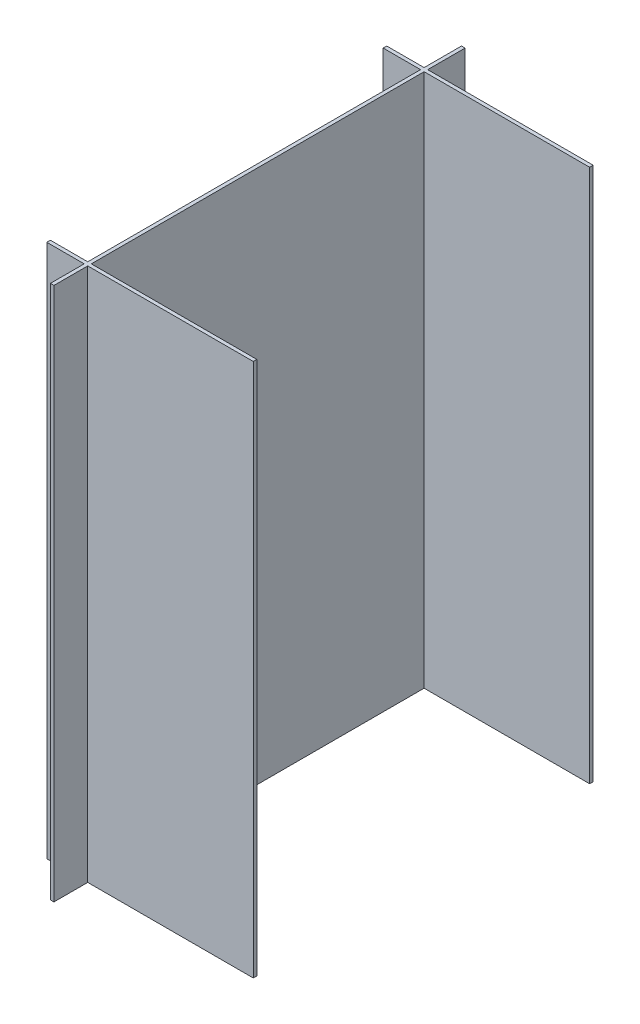
ISO-10303-21;
HEADER;
FILE_DESCRIPTION(('STEP AP214'),'2;1');
FILE_NAME('part.step','',(''),(''),'','','');
FILE_SCHEMA(('AUTOMOTIVE_DESIGN { 1 0 10303 214 1 1 1 1 }'));
ENDSEC;
DATA;
#1=APPLICATION_CONTEXT('core data for automotive mechanical design processes');
#2=APPLICATION_PROTOCOL_DEFINITION('international standard','automotive_design',2000,#1);
#3=PRODUCT_CONTEXT('',#1,'mechanical');
#4=PRODUCT('Part','Part','',(#3));
#5=PRODUCT_RELATED_PRODUCT_CATEGORY('part','',(#4));
#6=PRODUCT_DEFINITION_FORMATION('','',#4);
#7=PRODUCT_DEFINITION_CONTEXT('part definition',#1,'design');
#8=PRODUCT_DEFINITION('design','',#6,#7);
#9=PRODUCT_DEFINITION_SHAPE('','',#8);
#10=(LENGTH_UNIT() NAMED_UNIT(*) SI_UNIT(.MILLI.,.METRE.));
#11=(NAMED_UNIT(*) PLANE_ANGLE_UNIT() SI_UNIT($,.RADIAN.));
#12=(NAMED_UNIT(*) SI_UNIT($,.STERADIAN.) SOLID_ANGLE_UNIT());
#13=UNCERTAINTY_MEASURE_WITH_UNIT(LENGTH_MEASURE(1.E-05),#10,'distance_accuracy_value','');
#14=(GEOMETRIC_REPRESENTATION_CONTEXT(3) GLOBAL_UNCERTAINTY_ASSIGNED_CONTEXT((#13)) GLOBAL_UNIT_ASSIGNED_CONTEXT((#10,
#11,#12)) REPRESENTATION_CONTEXT('',''));
#15=CARTESIAN_POINT('',(0.,0.,0.));
#16=DIRECTION('',(0.,0.,1.));
#17=DIRECTION('',(1.,0.,0.));
#18=AXIS2_PLACEMENT_3D('',#15,#16,#17);
#19=CARTESIAN_POINT('',(-56.1616111521953,300.,42.3022668872637));
#20=DIRECTION('',(1.,0.,0.));
#21=DIRECTION('',(0.,0.,-1.));
#22=AXIS2_PLACEMENT_3D('',#19,#20,#21);
#23=PLANE('',#22);
#24=DIRECTION('',(0.,0.,1.));
#25=VECTOR('',#24,1.);
#26=CARTESIAN_POINT('',(-56.1616111521953,0.,42.3022668872637));
#27=LINE('',#26,#25);
#28=CARTESIAN_POINT('',(-56.1616111521953,0.,42.3022668872637));
#29=VERTEX_POINT('',#28);
#30=CARTESIAN_POINT('',(-56.1616111521953,0.,44.3022668872637));
#31=VERTEX_POINT('',#30);
#32=EDGE_CURVE('E214',#29,#31,#27,.T.);
#33=ORIENTED_EDGE('',*,*,#32,.T.);
#34=DIRECTION('',(0.,-1.,0.));
#35=VECTOR('',#34,1.);
#36=CARTESIAN_POINT('',(-56.1616111521953,300.,44.3022668872637));
#37=LINE('',#36,#35);
#38=CARTESIAN_POINT('',(-56.1616111521953,300.,44.3022668872637));
#39=VERTEX_POINT('',#38);
#40=EDGE_CURVE('E11',#39,#31,#37,.T.);
#41=ORIENTED_EDGE('',*,*,#40,.F.);
#42=DIRECTION('',(0.,0.,1.));
#43=VECTOR('',#42,1.);
#44=CARTESIAN_POINT('',(-56.1616111521953,300.,42.3022668872637));
#45=LINE('',#44,#43);
#46=CARTESIAN_POINT('',(-56.1616111521953,300.,42.3022668872637));
#47=VERTEX_POINT('',#46);
#48=EDGE_CURVE('E272',#47,#39,#45,.T.);
#49=ORIENTED_EDGE('',*,*,#48,.F.);
#50=DIRECTION('',(0.,-1.,0.));
#51=VECTOR('',#50,1.);
#52=CARTESIAN_POINT('',(-56.1616111521953,300.,42.3022668872637));
#53=LINE('',#52,#51);
#54=EDGE_CURVE('E210',#47,#29,#53,.T.);
#55=ORIENTED_EDGE('',*,*,#54,.T.);
#56=EDGE_LOOP('',(#33,#41,#49,#55));
#57=FACE_BOUND('',#56,.T.);
#58=ADVANCED_FACE('F41',(#57),#23,.F.);
#59=CARTESIAN_POINT('',(-56.1616111521953,300.,44.3022668872637));
#60=DIRECTION('',(0.,0.,-1.));
#61=DIRECTION('',(-1.,0.,0.));
#62=AXIS2_PLACEMENT_3D('',#59,#60,#61);
#63=PLANE('',#62);
#64=DIRECTION('',(1.,0.,0.));
#65=VECTOR('',#64,1.);
#66=CARTESIAN_POINT('',(-56.1616111521953,0.,44.3022668872637));
#67=LINE('',#66,#65);
#68=CARTESIAN_POINT('',(-35.1616111521953,0.,44.3022668872637));
#69=VERTEX_POINT('',#68);
#70=EDGE_CURVE('E218',#31,#69,#67,.T.);
#71=ORIENTED_EDGE('',*,*,#70,.T.);
#72=DIRECTION('',(0.,-1.,0.));
#73=VECTOR('',#72,1.);
#74=CARTESIAN_POINT('',(-35.1616111521953,300.,44.3022668872637));
#75=LINE('',#74,#73);
#76=CARTESIAN_POINT('',(-35.1616111521953,300.,44.3022668872637));
#77=VERTEX_POINT('',#76);
#78=EDGE_CURVE('E50',#77,#69,#75,.T.);
#79=ORIENTED_EDGE('',*,*,#78,.F.);
#80=DIRECTION('',(1.,0.,0.));
#81=VECTOR('',#80,1.);
#82=CARTESIAN_POINT('',(-56.1616111521953,300.,44.3022668872637));
#83=LINE('',#82,#81);
#84=EDGE_CURVE('E137',#39,#77,#83,.T.);
#85=ORIENTED_EDGE('',*,*,#84,.F.);
#86=ORIENTED_EDGE('',*,*,#40,.T.);
#87=EDGE_LOOP('',(#71,#79,#85,#86));
#88=FACE_BOUND('',#87,.T.);
#89=ADVANCED_FACE('F422',(#88),#63,.F.);
#90=CARTESIAN_POINT('',(-35.1616111521953,300.,44.3022668872637));
#91=DIRECTION('',(1.,0.,0.));
#92=DIRECTION('',(0.,0.,-1.));
#93=AXIS2_PLACEMENT_3D('',#90,#91,#92);
#94=PLANE('',#93);
#95=DIRECTION('',(0.,0.,1.));
#96=VECTOR('',#95,1.);
#97=CARTESIAN_POINT('',(-35.1616111521953,0.,44.3022668872637));
#98=LINE('',#97,#96);
#99=CARTESIAN_POINT('',(-35.1616111521953,0.,231.302266887264));
#100=VERTEX_POINT('',#99);
#101=EDGE_CURVE('E221',#69,#100,#98,.T.);
#102=ORIENTED_EDGE('',*,*,#101,.T.);
#103=DIRECTION('',(0.,-1.,0.));
#104=VECTOR('',#103,1.);
#105=CARTESIAN_POINT('',(-35.1616111521953,300.,231.302266887264));
#106=LINE('',#105,#104);
#107=CARTESIAN_POINT('',(-35.1616111521953,300.,231.302266887264));
#108=VERTEX_POINT('',#107);
#109=EDGE_CURVE('E331',#108,#100,#106,.T.);
#110=ORIENTED_EDGE('',*,*,#109,.F.);
#111=DIRECTION('',(0.,0.,1.));
#112=VECTOR('',#111,1.);
#113=CARTESIAN_POINT('',(-35.1616111521953,300.,44.3022668872637));
#114=LINE('',#113,#112);
#115=EDGE_CURVE('E341',#77,#108,#114,.T.);
#116=ORIENTED_EDGE('',*,*,#115,.F.);
#117=ORIENTED_EDGE('',*,*,#78,.T.);
#118=EDGE_LOOP('',(#102,#110,#116,#117));
#119=FACE_BOUND('',#118,.T.);
#120=ADVANCED_FACE('F339',(#119),#94,.F.);
#121=CARTESIAN_POINT('',(-35.1616111521953,300.,231.302266887264));
#122=DIRECTION('',(0.,0.,1.));
#123=DIRECTION('',(1.,0.,0.));
#124=AXIS2_PLACEMENT_3D('',#121,#122,#123);
#125=PLANE('',#124);
#126=DIRECTION('',(-1.,0.,0.));
#127=VECTOR('',#126,1.);
#128=CARTESIAN_POINT('',(-35.1616111521953,0.,231.302266887264));
#129=LINE('',#128,#127);
#130=CARTESIAN_POINT('',(-56.1616111521953,0.,231.302266887264));
#131=VERTEX_POINT('',#130);
#132=EDGE_CURVE('E224',#100,#131,#129,.T.);
#133=ORIENTED_EDGE('',*,*,#132,.T.);
#134=DIRECTION('',(0.,-1.,0.));
#135=VECTOR('',#134,1.);
#136=CARTESIAN_POINT('',(-56.1616111521953,300.,231.302266887264));
#137=LINE('',#136,#135);
#138=CARTESIAN_POINT('',(-56.1616111521953,300.,231.302266887264));
#139=VERTEX_POINT('',#138);
#140=EDGE_CURVE('E327',#139,#131,#137,.T.);
#141=ORIENTED_EDGE('',*,*,#140,.F.);
#142=DIRECTION('',(-1.,0.,0.));
#143=VECTOR('',#142,1.);
#144=CARTESIAN_POINT('',(-35.1616111521953,300.,231.302266887264));
#145=LINE('',#144,#143);
#146=EDGE_CURVE('E360',#108,#139,#145,.T.);
#147=ORIENTED_EDGE('',*,*,#146,.F.);
#148=ORIENTED_EDGE('',*,*,#109,.T.);
#149=EDGE_LOOP('',(#133,#141,#147,#148));
#150=FACE_BOUND('',#149,.T.);
#151=ADVANCED_FACE('F350',(#150),#125,.F.);
#152=CARTESIAN_POINT('',(-56.1616111521953,300.,231.302266887264));
#153=DIRECTION('',(1.,0.,0.));
#154=DIRECTION('',(0.,0.,-1.));
#155=AXIS2_PLACEMENT_3D('',#152,#153,#154);
#156=PLANE('',#155);
#157=DIRECTION('',(0.,0.,1.));
#158=VECTOR('',#157,1.);
#159=CARTESIAN_POINT('',(-56.1616111521953,0.,231.302266887264));
#160=LINE('',#159,#158);
#161=CARTESIAN_POINT('',(-56.1616111521953,0.,233.302266887264));
#162=VERTEX_POINT('',#161);
#163=EDGE_CURVE('E227',#131,#162,#160,.T.);
#164=ORIENTED_EDGE('',*,*,#163,.T.);
#165=DIRECTION('',(0.,-1.,0.));
#166=VECTOR('',#165,1.);
#167=CARTESIAN_POINT('',(-56.1616111521953,300.,233.302266887264));
#168=LINE('',#167,#166);
#169=CARTESIAN_POINT('',(-56.1616111521953,300.,233.302266887264));
#170=VERTEX_POINT('',#169);
#171=EDGE_CURVE('E323',#170,#162,#168,.T.);
#172=ORIENTED_EDGE('',*,*,#171,.F.);
#173=DIRECTION('',(0.,0.,1.));
#174=VECTOR('',#173,1.);
#175=CARTESIAN_POINT('',(-56.1616111521953,300.,231.302266887264));
#176=LINE('',#175,#174);
#177=EDGE_CURVE('E356',#139,#170,#176,.T.);
#178=ORIENTED_EDGE('',*,*,#177,.F.);
#179=ORIENTED_EDGE('',*,*,#140,.T.);
#180=EDGE_LOOP('',(#164,#172,#178,#179));
#181=FACE_BOUND('',#180,.T.);
#182=ADVANCED_FACE('F354',(#181),#156,.F.);
#183=CARTESIAN_POINT('',(-56.1616111521953,300.,233.302266887264));
#184=DIRECTION('',(0.,0.,-1.));
#185=DIRECTION('',(-1.,0.,0.));
#186=AXIS2_PLACEMENT_3D('',#183,#184,#185);
#187=PLANE('',#186);
#188=DIRECTION('',(1.,0.,0.));
#189=VECTOR('',#188,1.);
#190=CARTESIAN_POINT('',(-56.1616111521953,0.,233.302266887264));
#191=LINE('',#190,#189);
#192=CARTESIAN_POINT('',(-35.1616111521953,0.,233.302266887264));
#193=VERTEX_POINT('',#192);
#194=EDGE_CURVE('E230',#162,#193,#191,.T.);
#195=ORIENTED_EDGE('',*,*,#194,.T.);
#196=DIRECTION('',(0.,-1.,0.));
#197=VECTOR('',#196,1.);
#198=CARTESIAN_POINT('',(-35.1616111521953,300.,233.302266887264));
#199=LINE('',#198,#197);
#200=CARTESIAN_POINT('',(-35.1616111521953,300.,233.302266887264));
#201=VERTEX_POINT('',#200);
#202=EDGE_CURVE('E319',#201,#193,#199,.T.);
#203=ORIENTED_EDGE('',*,*,#202,.F.);
#204=DIRECTION('',(1.,0.,0.));
#205=VECTOR('',#204,1.);
#206=CARTESIAN_POINT('',(-56.1616111521953,300.,233.302266887264));
#207=LINE('',#206,#205);
#208=EDGE_CURVE('E359',#170,#201,#207,.T.);
#209=ORIENTED_EDGE('',*,*,#208,.F.);
#210=ORIENTED_EDGE('',*,*,#171,.T.);
#211=EDGE_LOOP('',(#195,#203,#209,#210));
#212=FACE_BOUND('',#211,.T.);
#213=ADVANCED_FACE('F435',(#212),#187,.F.);
#214=CARTESIAN_POINT('',(-35.1616111521953,300.,233.302266887264));
#215=DIRECTION('',(1.,0.,0.));
#216=DIRECTION('',(0.,0.,-1.));
#217=AXIS2_PLACEMENT_3D('',#214,#215,#216);
#218=PLANE('',#217);
#219=DIRECTION('',(0.,0.,1.));
#220=VECTOR('',#219,1.);
#221=CARTESIAN_POINT('',(-35.1616111521953,0.,233.302266887264));
#222=LINE('',#221,#220);
#223=CARTESIAN_POINT('',(-35.1616111521953,0.,252.302266887264));
#224=VERTEX_POINT('',#223);
#225=EDGE_CURVE('E233',#193,#224,#222,.T.);
#226=ORIENTED_EDGE('',*,*,#225,.T.);
#227=DIRECTION('',(0.,-1.,0.));
#228=VECTOR('',#227,1.);
#229=CARTESIAN_POINT('',(-35.1616111521953,300.,252.302266887264));
#230=LINE('',#229,#228);
#231=CARTESIAN_POINT('',(-35.1616111521953,300.,252.302266887264));
#232=VERTEX_POINT('',#231);
#233=EDGE_CURVE('E315',#232,#224,#230,.T.);
#234=ORIENTED_EDGE('',*,*,#233,.F.);
#235=DIRECTION('',(0.,0.,1.));
#236=VECTOR('',#235,1.);
#237=CARTESIAN_POINT('',(-35.1616111521953,300.,233.302266887264));
#238=LINE('',#237,#236);
#239=EDGE_CURVE('E364',#201,#232,#238,.T.);
#240=ORIENTED_EDGE('',*,*,#239,.F.);
#241=ORIENTED_EDGE('',*,*,#202,.T.);
#242=EDGE_LOOP('',(#226,#234,#240,#241));
#243=FACE_BOUND('',#242,.T.);
#244=ADVANCED_FACE('F438',(#243),#218,.F.);
#245=CARTESIAN_POINT('',(-35.1616111521953,300.,252.302266887264));
#246=DIRECTION('',(0.,0.,-1.));
#247=DIRECTION('',(-1.,0.,0.));
#248=AXIS2_PLACEMENT_3D('',#245,#246,#247);
#249=PLANE('',#248);
#250=DIRECTION('',(1.,0.,0.));
#251=VECTOR('',#250,1.);
#252=CARTESIAN_POINT('',(-35.1616111521953,0.,252.302266887264));
#253=LINE('',#252,#251);
#254=CARTESIAN_POINT('',(-33.1616111521953,0.,252.302266887264));
#255=VERTEX_POINT('',#254);
#256=EDGE_CURVE('E236',#224,#255,#253,.T.);
#257=ORIENTED_EDGE('',*,*,#256,.T.);
#258=DIRECTION('',(0.,-1.,0.));
#259=VECTOR('',#258,1.);
#260=CARTESIAN_POINT('',(-33.1616111521953,300.,252.302266887264));
#261=LINE('',#260,#259);
#262=CARTESIAN_POINT('',(-33.1616111521953,300.,252.302266887264));
#263=VERTEX_POINT('',#262);
#264=EDGE_CURVE('E311',#263,#255,#261,.T.);
#265=ORIENTED_EDGE('',*,*,#264,.F.);
#266=DIRECTION('',(1.,0.,0.));
#267=VECTOR('',#266,1.);
#268=CARTESIAN_POINT('',(-35.1616111521953,300.,252.302266887264));
#269=LINE('',#268,#267);
#270=EDGE_CURVE('E371',#232,#263,#269,.T.);
#271=ORIENTED_EDGE('',*,*,#270,.F.);
#272=ORIENTED_EDGE('',*,*,#233,.T.);
#273=EDGE_LOOP('',(#257,#265,#271,#272));
#274=FACE_BOUND('',#273,.T.);
#275=ADVANCED_FACE('F442',(#274),#249,.F.);
#276=CARTESIAN_POINT('',(-33.1616111521953,300.,233.302266887264));
#277=DIRECTION('',(-1.,0.,0.));
#278=DIRECTION('',(0.,0.,1.));
#279=AXIS2_PLACEMENT_3D('',#276,#277,#278);
#280=PLANE('',#279);
#281=DIRECTION('',(0.,0.,-1.));
#282=VECTOR('',#281,1.);
#283=CARTESIAN_POINT('',(-33.1616111521953,0.,233.302266887264));
#284=LINE('',#283,#282);
#285=CARTESIAN_POINT('',(-33.1616111521953,0.,233.302266887264));
#286=VERTEX_POINT('',#285);
#287=EDGE_CURVE('E239',#255,#286,#284,.T.);
#288=ORIENTED_EDGE('',*,*,#287,.T.);
#289=DIRECTION('',(0.,-1.,0.));
#290=VECTOR('',#289,1.);
#291=CARTESIAN_POINT('',(-33.1616111521953,300.,233.302266887264));
#292=LINE('',#291,#290);
#293=CARTESIAN_POINT('',(-33.1616111521953,300.,233.302266887264));
#294=VERTEX_POINT('',#293);
#295=EDGE_CURVE('E307',#294,#286,#292,.T.);
#296=ORIENTED_EDGE('',*,*,#295,.F.);
#297=DIRECTION('',(0.,0.,-1.));
#298=VECTOR('',#297,1.);
#299=CARTESIAN_POINT('',(-33.1616111521953,300.,233.302266887264));
#300=LINE('',#299,#298);
#301=EDGE_CURVE('E374',#263,#294,#300,.T.);
#302=ORIENTED_EDGE('',*,*,#301,.F.);
#303=ORIENTED_EDGE('',*,*,#264,.T.);
#304=EDGE_LOOP('',(#288,#296,#302,#303));
#305=FACE_BOUND('',#304,.T.);
#306=ADVANCED_FACE('F446',(#305),#280,.F.);
#307=CARTESIAN_POINT('',(-33.1616111521953,300.,233.302266887264));
#308=DIRECTION('',(0.,0.,-1.));
#309=DIRECTION('',(-1.,0.,0.));
#310=AXIS2_PLACEMENT_3D('',#307,#308,#309);
#311=PLANE('',#310);
#312=DIRECTION('',(1.,0.,0.));
#313=VECTOR('',#312,1.);
#314=CARTESIAN_POINT('',(-33.1616111521953,0.,233.302266887264));
#315=LINE('',#314,#313);
#316=CARTESIAN_POINT('',(59.8383888478047,0.,233.302266887264));
#317=VERTEX_POINT('',#316);
#318=EDGE_CURVE('E242',#286,#317,#315,.T.);
#319=ORIENTED_EDGE('',*,*,#318,.T.);
#320=DIRECTION('',(0.,-1.,0.));
#321=VECTOR('',#320,1.);
#322=CARTESIAN_POINT('',(59.8383888478047,300.,233.302266887264));
#323=LINE('',#322,#321);
#324=CARTESIAN_POINT('',(59.8383888478047,300.,233.302266887264));
#325=VERTEX_POINT('',#324);
#326=EDGE_CURVE('E303',#325,#317,#323,.T.);
#327=ORIENTED_EDGE('',*,*,#326,.F.);
#328=DIRECTION('',(1.,0.,0.));
#329=VECTOR('',#328,1.);
#330=CARTESIAN_POINT('',(-33.1616111521953,300.,233.302266887264));
#331=LINE('',#330,#329);
#332=EDGE_CURVE('E377',#294,#325,#331,.T.);
#333=ORIENTED_EDGE('',*,*,#332,.F.);
#334=ORIENTED_EDGE('',*,*,#295,.T.);
#335=EDGE_LOOP('',(#319,#327,#333,#334));
#336=FACE_BOUND('',#335,.T.);
#337=ADVANCED_FACE('F450',(#336),#311,.F.);
#338=CARTESIAN_POINT('',(59.8383888478047,300.,231.302266887264));
#339=DIRECTION('',(-1.,0.,0.));
#340=DIRECTION('',(0.,0.,1.));
#341=AXIS2_PLACEMENT_3D('',#338,#339,#340);
#342=PLANE('',#341);
#343=DIRECTION('',(0.,0.,-1.));
#344=VECTOR('',#343,1.);
#345=CARTESIAN_POINT('',(59.8383888478047,0.,231.302266887264));
#346=LINE('',#345,#344);
#347=CARTESIAN_POINT('',(59.8383888478047,0.,231.302266887264));
#348=VERTEX_POINT('',#347);
#349=EDGE_CURVE('E245',#317,#348,#346,.T.);
#350=ORIENTED_EDGE('',*,*,#349,.T.);
#351=DIRECTION('',(0.,-1.,0.));
#352=VECTOR('',#351,1.);
#353=CARTESIAN_POINT('',(59.8383888478047,300.,231.302266887264));
#354=LINE('',#353,#352);
#355=CARTESIAN_POINT('',(59.8383888478047,300.,231.302266887264));
#356=VERTEX_POINT('',#355);
#357=EDGE_CURVE('E299',#356,#348,#354,.T.);
#358=ORIENTED_EDGE('',*,*,#357,.F.);
#359=DIRECTION('',(0.,0.,-1.));
#360=VECTOR('',#359,1.);
#361=CARTESIAN_POINT('',(59.8383888478047,300.,231.302266887264));
#362=LINE('',#361,#360);
#363=EDGE_CURVE('E380',#325,#356,#362,.T.);
#364=ORIENTED_EDGE('',*,*,#363,.F.);
#365=ORIENTED_EDGE('',*,*,#326,.T.);
#366=EDGE_LOOP('',(#350,#358,#364,#365));
#367=FACE_BOUND('',#366,.T.);
#368=ADVANCED_FACE('F454',(#367),#342,.F.);
#369=CARTESIAN_POINT('',(-33.1616111521953,300.,231.302266887264));
#370=DIRECTION('',(0.,0.,1.));
#371=DIRECTION('',(1.,0.,0.));
#372=AXIS2_PLACEMENT_3D('',#369,#370,#371);
#373=PLANE('',#372);
#374=DIRECTION('',(-1.,0.,0.));
#375=VECTOR('',#374,1.);
#376=CARTESIAN_POINT('',(-33.1616111521953,0.,231.302266887264));
#377=LINE('',#376,#375);
#378=CARTESIAN_POINT('',(-33.1616111521953,0.,231.302266887264));
#379=VERTEX_POINT('',#378);
#380=EDGE_CURVE('E248',#348,#379,#377,.T.);
#381=ORIENTED_EDGE('',*,*,#380,.T.);
#382=DIRECTION('',(0.,-1.,0.));
#383=VECTOR('',#382,1.);
#384=CARTESIAN_POINT('',(-33.1616111521953,300.,231.302266887264));
#385=LINE('',#384,#383);
#386=CARTESIAN_POINT('',(-33.1616111521953,300.,231.302266887264));
#387=VERTEX_POINT('',#386);
#388=EDGE_CURVE('E295',#387,#379,#385,.T.);
#389=ORIENTED_EDGE('',*,*,#388,.F.);
#390=DIRECTION('',(-1.,0.,0.));
#391=VECTOR('',#390,1.);
#392=CARTESIAN_POINT('',(-33.1616111521953,300.,231.302266887264));
#393=LINE('',#392,#391);
#394=EDGE_CURVE('E383',#356,#387,#393,.T.);
#395=ORIENTED_EDGE('',*,*,#394,.F.);
#396=ORIENTED_EDGE('',*,*,#357,.T.);
#397=EDGE_LOOP('',(#381,#389,#395,#396));
#398=FACE_BOUND('',#397,.T.);
#399=ADVANCED_FACE('F458',(#398),#373,.F.);
#400=CARTESIAN_POINT('',(-33.1616111521953,300.,44.3022668872637));
#401=DIRECTION('',(-1.,0.,0.));
#402=DIRECTION('',(0.,0.,1.));
#403=AXIS2_PLACEMENT_3D('',#400,#401,#402);
#404=PLANE('',#403);
#405=DIRECTION('',(0.,0.,-1.));
#406=VECTOR('',#405,1.);
#407=CARTESIAN_POINT('',(-33.1616111521953,0.,44.3022668872637));
#408=LINE('',#407,#406);
#409=CARTESIAN_POINT('',(-33.1616111521953,0.,44.3022668872637));
#410=VERTEX_POINT('',#409);
#411=EDGE_CURVE('E251',#379,#410,#408,.T.);
#412=ORIENTED_EDGE('',*,*,#411,.T.);
#413=DIRECTION('',(0.,-1.,0.));
#414=VECTOR('',#413,1.);
#415=CARTESIAN_POINT('',(-33.1616111521953,300.,44.3022668872637));
#416=LINE('',#415,#414);
#417=CARTESIAN_POINT('',(-33.1616111521953,300.,44.3022668872637));
#418=VERTEX_POINT('',#417);
#419=EDGE_CURVE('E291',#418,#410,#416,.T.);
#420=ORIENTED_EDGE('',*,*,#419,.F.);
#421=DIRECTION('',(0.,0.,-1.));
#422=VECTOR('',#421,1.);
#423=CARTESIAN_POINT('',(-33.1616111521953,300.,44.3022668872637));
#424=LINE('',#423,#422);
#425=EDGE_CURVE('E386',#387,#418,#424,.T.);
#426=ORIENTED_EDGE('',*,*,#425,.F.);
#427=ORIENTED_EDGE('',*,*,#388,.T.);
#428=EDGE_LOOP('',(#412,#420,#426,#427));
#429=FACE_BOUND('',#428,.T.);
#430=ADVANCED_FACE('F462',(#429),#404,.F.);
#431=CARTESIAN_POINT('',(-33.1616111521953,300.,44.3022668872637));
#432=DIRECTION('',(0.,0.,-1.));
#433=DIRECTION('',(-1.,0.,0.));
#434=AXIS2_PLACEMENT_3D('',#431,#432,#433);
#435=PLANE('',#434);
#436=DIRECTION('',(1.,0.,0.));
#437=VECTOR('',#436,1.);
#438=CARTESIAN_POINT('',(-33.1616111521953,0.,44.3022668872637));
#439=LINE('',#438,#437);
#440=CARTESIAN_POINT('',(59.8383888478047,0.,44.3022668872637));
#441=VERTEX_POINT('',#440);
#442=EDGE_CURVE('E254',#410,#441,#439,.T.);
#443=ORIENTED_EDGE('',*,*,#442,.T.);
#444=DIRECTION('',(0.,-1.,0.));
#445=VECTOR('',#444,1.);
#446=CARTESIAN_POINT('',(59.8383888478047,300.,44.3022668872637));
#447=LINE('',#446,#445);
#448=CARTESIAN_POINT('',(59.8383888478047,300.,44.3022668872637));
#449=VERTEX_POINT('',#448);
#450=EDGE_CURVE('E287',#449,#441,#447,.T.);
#451=ORIENTED_EDGE('',*,*,#450,.F.);
#452=DIRECTION('',(1.,0.,0.));
#453=VECTOR('',#452,1.);
#454=CARTESIAN_POINT('',(-33.1616111521953,300.,44.3022668872637));
#455=LINE('',#454,#453);
#456=EDGE_CURVE('E389',#418,#449,#455,.T.);
#457=ORIENTED_EDGE('',*,*,#456,.F.);
#458=ORIENTED_EDGE('',*,*,#419,.T.);
#459=EDGE_LOOP('',(#443,#451,#457,#458));
#460=FACE_BOUND('',#459,.T.);
#461=ADVANCED_FACE('F466',(#460),#435,.F.);
#462=CARTESIAN_POINT('',(59.8383888478047,300.,42.3022668872637));
#463=DIRECTION('',(-1.,0.,0.));
#464=DIRECTION('',(0.,0.,1.));
#465=AXIS2_PLACEMENT_3D('',#462,#463,#464);
#466=PLANE('',#465);
#467=DIRECTION('',(0.,0.,-1.));
#468=VECTOR('',#467,1.);
#469=CARTESIAN_POINT('',(59.8383888478047,0.,42.3022668872637));
#470=LINE('',#469,#468);
#471=CARTESIAN_POINT('',(59.8383888478047,0.,42.3022668872637));
#472=VERTEX_POINT('',#471);
#473=EDGE_CURVE('E257',#441,#472,#470,.T.);
#474=ORIENTED_EDGE('',*,*,#473,.T.);
#475=DIRECTION('',(0.,-1.,0.));
#476=VECTOR('',#475,1.);
#477=CARTESIAN_POINT('',(59.8383888478047,300.,42.3022668872637));
#478=LINE('',#477,#476);
#479=CARTESIAN_POINT('',(59.8383888478047,300.,42.3022668872637));
#480=VERTEX_POINT('',#479);
#481=EDGE_CURVE('E283',#480,#472,#478,.T.);
#482=ORIENTED_EDGE('',*,*,#481,.F.);
#483=DIRECTION('',(0.,0.,-1.));
#484=VECTOR('',#483,1.);
#485=CARTESIAN_POINT('',(59.8383888478047,300.,42.3022668872637));
#486=LINE('',#485,#484);
#487=EDGE_CURVE('E392',#449,#480,#486,.T.);
#488=ORIENTED_EDGE('',*,*,#487,.F.);
#489=ORIENTED_EDGE('',*,*,#450,.T.);
#490=EDGE_LOOP('',(#474,#482,#488,#489));
#491=FACE_BOUND('',#490,.T.);
#492=ADVANCED_FACE('F470',(#491),#466,.F.);
#493=CARTESIAN_POINT('',(-33.1616111521953,300.,42.3022668872637));
#494=DIRECTION('',(0.,0.,1.));
#495=DIRECTION('',(1.,0.,0.));
#496=AXIS2_PLACEMENT_3D('',#493,#494,#495);
#497=PLANE('',#496);
#498=DIRECTION('',(-1.,0.,0.));
#499=VECTOR('',#498,1.);
#500=CARTESIAN_POINT('',(-33.1616111521953,0.,42.3022668872637));
#501=LINE('',#500,#499);
#502=CARTESIAN_POINT('',(-33.1616111521953,0.,42.3022668872637));
#503=VERTEX_POINT('',#502);
#504=EDGE_CURVE('E260',#472,#503,#501,.T.);
#505=ORIENTED_EDGE('',*,*,#504,.T.);
#506=DIRECTION('',(0.,-1.,0.));
#507=VECTOR('',#506,1.);
#508=CARTESIAN_POINT('',(-33.1616111521953,300.,42.3022668872637));
#509=LINE('',#508,#507);
#510=CARTESIAN_POINT('',(-33.1616111521953,300.,42.3022668872637));
#511=VERTEX_POINT('',#510);
#512=EDGE_CURVE('E279',#511,#503,#509,.T.);
#513=ORIENTED_EDGE('',*,*,#512,.F.);
#514=DIRECTION('',(-1.,0.,0.));
#515=VECTOR('',#514,1.);
#516=CARTESIAN_POINT('',(-33.1616111521953,300.,42.3022668872637));
#517=LINE('',#516,#515);
#518=EDGE_CURVE('E395',#480,#511,#517,.T.);
#519=ORIENTED_EDGE('',*,*,#518,.F.);
#520=ORIENTED_EDGE('',*,*,#481,.T.);
#521=EDGE_LOOP('',(#505,#513,#519,#520));
#522=FACE_BOUND('',#521,.T.);
#523=ADVANCED_FACE('F403',(#522),#497,.F.);
#524=CARTESIAN_POINT('',(-33.1616111521953,300.,42.3022668872637));
#525=DIRECTION('',(-1.,0.,0.));
#526=DIRECTION('',(0.,0.,1.));
#527=AXIS2_PLACEMENT_3D('',#524,#525,#526);
#528=PLANE('',#527);
#529=DIRECTION('',(0.,0.,-1.));
#530=VECTOR('',#529,1.);
#531=CARTESIAN_POINT('',(-33.1616111521953,0.,42.3022668872637));
#532=LINE('',#531,#530);
#533=CARTESIAN_POINT('',(-33.1616111521953,0.,21.3022668872637));
#534=VERTEX_POINT('',#533);
#535=EDGE_CURVE('E263',#503,#534,#532,.T.);
#536=ORIENTED_EDGE('',*,*,#535,.T.);
#537=DIRECTION('',(0.,-1.,0.));
#538=VECTOR('',#537,1.);
#539=CARTESIAN_POINT('',(-33.1616111521953,300.,21.3022668872637));
#540=LINE('',#539,#538);
#541=CARTESIAN_POINT('',(-33.1616111521953,300.,21.3022668872637));
#542=VERTEX_POINT('',#541);
#543=EDGE_CURVE('E203',#542,#534,#540,.T.);
#544=ORIENTED_EDGE('',*,*,#543,.F.);
#545=DIRECTION('',(0.,0.,-1.));
#546=VECTOR('',#545,1.);
#547=CARTESIAN_POINT('',(-33.1616111521953,300.,42.3022668872637));
#548=LINE('',#547,#546);
#549=EDGE_CURVE('E192',#511,#542,#548,.T.);
#550=ORIENTED_EDGE('',*,*,#549,.F.);
#551=ORIENTED_EDGE('',*,*,#512,.T.);
#552=EDGE_LOOP('',(#536,#544,#550,#551));
#553=FACE_BOUND('',#552,.T.);
#554=ADVANCED_FACE('F407',(#553),#528,.F.);
#555=CARTESIAN_POINT('',(-35.1616111521953,300.,21.3022668872637));
#556=DIRECTION('',(0.,0.,1.));
#557=DIRECTION('',(1.,0.,0.));
#558=AXIS2_PLACEMENT_3D('',#555,#556,#557);
#559=PLANE('',#558);
#560=DIRECTION('',(-1.,0.,0.));
#561=VECTOR('',#560,1.);
#562=CARTESIAN_POINT('',(-35.1616111521953,0.,21.3022668872637));
#563=LINE('',#562,#561);
#564=CARTESIAN_POINT('',(-35.1616111521953,0.,21.3022668872637));
#565=VERTEX_POINT('',#564);
#566=EDGE_CURVE('E201',#534,#565,#563,.T.);
#567=ORIENTED_EDGE('',*,*,#566,.T.);
#568=DIRECTION('',(0.,-1.,0.));
#569=VECTOR('',#568,1.);
#570=CARTESIAN_POINT('',(-35.1616111521953,300.,21.3022668872637));
#571=LINE('',#570,#569);
#572=CARTESIAN_POINT('',(-35.1616111521953,300.,21.3022668872637));
#573=VERTEX_POINT('',#572);
#574=EDGE_CURVE('E198',#573,#565,#571,.T.);
#575=ORIENTED_EDGE('',*,*,#574,.F.);
#576=DIRECTION('',(-1.,0.,0.));
#577=VECTOR('',#576,1.);
#578=CARTESIAN_POINT('',(-35.1616111521953,300.,21.3022668872637));
#579=LINE('',#578,#577);
#580=EDGE_CURVE('E186',#542,#573,#579,.T.);
#581=ORIENTED_EDGE('',*,*,#580,.F.);
#582=ORIENTED_EDGE('',*,*,#543,.T.);
#583=EDGE_LOOP('',(#567,#575,#581,#582));
#584=FACE_BOUND('',#583,.T.);
#585=ADVANCED_FACE('F199',(#584),#559,.F.);
#586=CARTESIAN_POINT('',(-35.1616111521953,300.,42.3022668872637));
#587=DIRECTION('',(1.,0.,0.));
#588=DIRECTION('',(0.,0.,-1.));
#589=AXIS2_PLACEMENT_3D('',#586,#587,#588);
#590=PLANE('',#589);
#591=DIRECTION('',(0.,0.,1.));
#592=VECTOR('',#591,1.);
#593=CARTESIAN_POINT('',(-35.1616111521953,0.,42.3022668872637));
#594=LINE('',#593,#592);
#595=CARTESIAN_POINT('',(-35.1616111521953,0.,42.3022668872637));
#596=VERTEX_POINT('',#595);
#597=EDGE_CURVE('E123',#565,#596,#594,.T.);
#598=ORIENTED_EDGE('',*,*,#597,.T.);
#599=DIRECTION('',(0.,-1.,0.));
#600=VECTOR('',#599,1.);
#601=CARTESIAN_POINT('',(-35.1616111521953,300.,42.3022668872637));
#602=LINE('',#601,#600);
#603=CARTESIAN_POINT('',(-35.1616111521953,300.,42.3022668872637));
#604=VERTEX_POINT('',#603);
#605=EDGE_CURVE('E204',#604,#596,#602,.T.);
#606=ORIENTED_EDGE('',*,*,#605,.F.);
#607=DIRECTION('',(0.,0.,1.));
#608=VECTOR('',#607,1.);
#609=CARTESIAN_POINT('',(-35.1616111521953,300.,42.3022668872637));
#610=LINE('',#609,#608);
#611=EDGE_CURVE('E190',#573,#604,#610,.T.);
#612=ORIENTED_EDGE('',*,*,#611,.F.);
#613=ORIENTED_EDGE('',*,*,#574,.T.);
#614=EDGE_LOOP('',(#598,#606,#612,#613));
#615=FACE_BOUND('',#614,.T.);
#616=ADVANCED_FACE('F206',(#615),#590,.F.);
#617=CARTESIAN_POINT('',(-56.1616111521953,300.,42.3022668872637));
#618=DIRECTION('',(0.,0.,1.));
#619=DIRECTION('',(1.,0.,0.));
#620=AXIS2_PLACEMENT_3D('',#617,#618,#619);
#621=PLANE('',#620);
#622=DIRECTION('',(-1.,0.,0.));
#623=VECTOR('',#622,1.);
#624=CARTESIAN_POINT('',(-56.1616111521953,0.,42.3022668872637));
#625=LINE('',#624,#623);
#626=EDGE_CURVE('E129',#596,#29,#625,.T.);
#627=ORIENTED_EDGE('',*,*,#626,.T.);
#628=ORIENTED_EDGE('',*,*,#54,.F.);
#629=DIRECTION('',(-1.,0.,0.));
#630=VECTOR('',#629,1.);
#631=CARTESIAN_POINT('',(-56.1616111521953,300.,42.3022668872637));
#632=LINE('',#631,#630);
#633=EDGE_CURVE('E58',#604,#47,#632,.T.);
#634=ORIENTED_EDGE('',*,*,#633,.F.);
#635=ORIENTED_EDGE('',*,*,#605,.T.);
#636=EDGE_LOOP('',(#627,#628,#634,#635));
#637=FACE_BOUND('',#636,.T.);
#638=ADVANCED_FACE('F411',(#637),#621,.F.);
#639=CARTESIAN_POINT('',(0.,300.,0.));
#640=DIRECTION('',(0.,1.,0.));
#641=DIRECTION('',(0.,0.,1.));
#642=AXIS2_PLACEMENT_3D('',#639,#640,#641);
#643=PLANE('',#642);
#644=ORIENTED_EDGE('',*,*,#48,.T.);
#645=ORIENTED_EDGE('',*,*,#84,.T.);
#646=ORIENTED_EDGE('',*,*,#115,.T.);
#647=ORIENTED_EDGE('',*,*,#146,.T.);
#648=ORIENTED_EDGE('',*,*,#177,.T.);
#649=ORIENTED_EDGE('',*,*,#208,.T.);
#650=ORIENTED_EDGE('',*,*,#239,.T.);
#651=ORIENTED_EDGE('',*,*,#270,.T.);
#652=ORIENTED_EDGE('',*,*,#301,.T.);
#653=ORIENTED_EDGE('',*,*,#332,.T.);
#654=ORIENTED_EDGE('',*,*,#363,.T.);
#655=ORIENTED_EDGE('',*,*,#394,.T.);
#656=ORIENTED_EDGE('',*,*,#425,.T.);
#657=ORIENTED_EDGE('',*,*,#456,.T.);
#658=ORIENTED_EDGE('',*,*,#487,.T.);
#659=ORIENTED_EDGE('',*,*,#518,.T.);
#660=ORIENTED_EDGE('',*,*,#549,.T.);
#661=ORIENTED_EDGE('',*,*,#580,.T.);
#662=ORIENTED_EDGE('',*,*,#611,.T.);
#663=ORIENTED_EDGE('',*,*,#633,.T.);
#664=EDGE_LOOP('',(#644,#645,#646,#647,#648,#649,#650,#651,#652,#653,#654,#655,#656,#657,#658,
#659,#660,#661,#662,#663));
#665=FACE_BOUND('',#664,.T.);
#666=ADVANCED_FACE('F188',(#665),#643,.T.);
#667=CARTESIAN_POINT('',(0.,0.,0.));
#668=DIRECTION('',(0.,1.,0.));
#669=DIRECTION('',(0.,0.,1.));
#670=AXIS2_PLACEMENT_3D('',#667,#668,#669);
#671=PLANE('',#670);
#672=ORIENTED_EDGE('',*,*,#32,.F.);
#673=ORIENTED_EDGE('',*,*,#626,.F.);
#674=ORIENTED_EDGE('',*,*,#597,.F.);
#675=ORIENTED_EDGE('',*,*,#566,.F.);
#676=ORIENTED_EDGE('',*,*,#535,.F.);
#677=ORIENTED_EDGE('',*,*,#504,.F.);
#678=ORIENTED_EDGE('',*,*,#473,.F.);
#679=ORIENTED_EDGE('',*,*,#442,.F.);
#680=ORIENTED_EDGE('',*,*,#411,.F.);
#681=ORIENTED_EDGE('',*,*,#380,.F.);
#682=ORIENTED_EDGE('',*,*,#349,.F.);
#683=ORIENTED_EDGE('',*,*,#318,.F.);
#684=ORIENTED_EDGE('',*,*,#287,.F.);
#685=ORIENTED_EDGE('',*,*,#256,.F.);
#686=ORIENTED_EDGE('',*,*,#225,.F.);
#687=ORIENTED_EDGE('',*,*,#194,.F.);
#688=ORIENTED_EDGE('',*,*,#163,.F.);
#689=ORIENTED_EDGE('',*,*,#132,.F.);
#690=ORIENTED_EDGE('',*,*,#101,.F.);
#691=ORIENTED_EDGE('',*,*,#70,.F.);
#692=EDGE_LOOP('',(#672,#673,#674,#675,#676,#677,#678,#679,#680,#681,#682,#683,#684,#685,#686,
#687,#688,#689,#690,#691));
#693=FACE_BOUND('',#692,.T.);
#694=ADVANCED_FACE('F345',(#693),#671,.F.);
#695=CLOSED_SHELL('',(#58,#89,#120,#151,#182,#213,#244,#275,#306,#337,#368,#399,#430,#461,#492,
#523,#554,#585,#616,#638,#666,#694));
#696=MANIFOLD_SOLID_BREP('B2',#695);
#697=ADVANCED_BREP_SHAPE_REPRESENTATION('',(#18,#696),#14);
#698=SHAPE_DEFINITION_REPRESENTATION(#9,#697);
ENDSEC;
END-ISO-10303-21;
